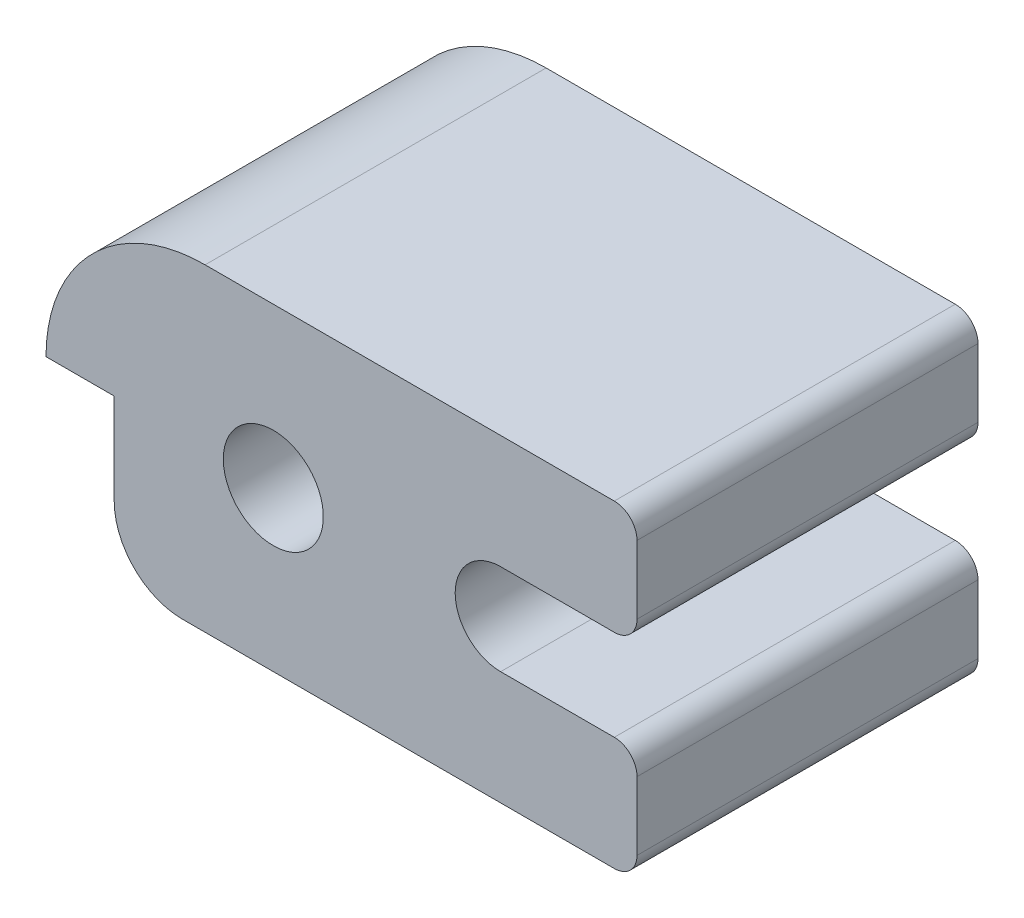
ISO-10303-21;
HEADER;
FILE_DESCRIPTION(('STEP AP214'),'2;1');
FILE_NAME('part.step','',(''),(''),'','','');
FILE_SCHEMA(('AUTOMOTIVE_DESIGN { 1 0 10303 214 1 1 1 1 }'));
ENDSEC;
DATA;
#1=APPLICATION_CONTEXT('core data for automotive mechanical design processes');
#2=APPLICATION_PROTOCOL_DEFINITION('international standard','automotive_design',2000,#1);
#3=PRODUCT_CONTEXT('',#1,'mechanical');
#4=PRODUCT('Part','Part','',(#3));
#5=PRODUCT_RELATED_PRODUCT_CATEGORY('part','',(#4));
#6=PRODUCT_DEFINITION_FORMATION('','',#4);
#7=PRODUCT_DEFINITION_CONTEXT('part definition',#1,'design');
#8=PRODUCT_DEFINITION('design','',#6,#7);
#9=PRODUCT_DEFINITION_SHAPE('','',#8);
#10=(LENGTH_UNIT() NAMED_UNIT(*) SI_UNIT(.MILLI.,.METRE.));
#11=(NAMED_UNIT(*) PLANE_ANGLE_UNIT() SI_UNIT($,.RADIAN.));
#12=(NAMED_UNIT(*) SI_UNIT($,.STERADIAN.) SOLID_ANGLE_UNIT());
#13=UNCERTAINTY_MEASURE_WITH_UNIT(LENGTH_MEASURE(1.E-05),#10,'distance_accuracy_value','');
#14=(GEOMETRIC_REPRESENTATION_CONTEXT(3) GLOBAL_UNCERTAINTY_ASSIGNED_CONTEXT((#13)) GLOBAL_UNIT_ASSIGNED_CONTEXT((#10,
#11,#12)) REPRESENTATION_CONTEXT('',''));
#15=CARTESIAN_POINT('',(0.,0.,0.));
#16=DIRECTION('',(0.,0.,1.));
#17=DIRECTION('',(1.,0.,0.));
#18=AXIS2_PLACEMENT_3D('',#15,#16,#17);
#19=CARTESIAN_POINT('',(12.7,0.,19.05));
#20=DIRECTION('',(0.,0.,-1.));
#21=DIRECTION('',(-1.,0.,0.));
#22=AXIS2_PLACEMENT_3D('',#19,#20,#21);
#23=PLANE('',#22);
#24=DIRECTION('',(0.,-1.,0.));
#25=VECTOR('',#24,1.);
#26=CARTESIAN_POINT('',(-8.89,0.,19.05));
#27=LINE('',#26,#25);
#28=CARTESIAN_POINT('',(-8.89,0.,19.05));
#29=VERTEX_POINT('',#28);
#30=CARTESIAN_POINT('',(-8.89,-5.08,19.05));
#31=VERTEX_POINT('',#30);
#32=EDGE_CURVE('E199',#29,#31,#27,.T.);
#33=ORIENTED_EDGE('',*,*,#32,.T.);
#34=CARTESIAN_POINT('',(-5.08,-5.08,19.05));
#35=DIRECTION('',(0.,0.,-1.));
#36=DIRECTION('',(-1.,0.,0.));
#37=AXIS2_PLACEMENT_3D('',#34,#35,#36);
#38=CIRCLE('',#37,3.81);
#39=CARTESIAN_POINT('',(-5.08,-8.89,19.05));
#40=VERTEX_POINT('',#39);
#41=EDGE_CURVE('E11',#31,#40,#38,.F.);
#42=ORIENTED_EDGE('',*,*,#41,.T.);
#43=DIRECTION('',(1.,0.,0.));
#44=VECTOR('',#43,1.);
#45=CARTESIAN_POINT('',(-8.89,-8.89,19.05));
#46=LINE('',#45,#44);
#47=CARTESIAN_POINT('',(19.05,-8.89,19.05));
#48=VERTEX_POINT('',#47);
#49=EDGE_CURVE('E202',#40,#48,#46,.T.);
#50=ORIENTED_EDGE('',*,*,#49,.T.);
#51=CARTESIAN_POINT('',(19.05,-7.62,19.05));
#52=DIRECTION('',(0.,0.,-1.));
#53=DIRECTION('',(-1.,0.,0.));
#54=AXIS2_PLACEMENT_3D('',#51,#52,#53);
#55=CIRCLE('',#54,1.27);
#56=CARTESIAN_POINT('',(20.32,-7.62,19.05));
#57=VERTEX_POINT('',#56);
#58=EDGE_CURVE('E287',#48,#57,#55,.F.);
#59=ORIENTED_EDGE('',*,*,#58,.T.);
#60=DIRECTION('',(0.,1.,0.));
#61=VECTOR('',#60,1.);
#62=CARTESIAN_POINT('',(20.32,-8.89,19.05));
#63=LINE('',#62,#61);
#64=CARTESIAN_POINT('',(20.32,-3.81,19.05));
#65=VERTEX_POINT('',#64);
#66=EDGE_CURVE('E166',#57,#65,#63,.T.);
#67=ORIENTED_EDGE('',*,*,#66,.T.);
#68=CARTESIAN_POINT('',(19.05,-3.81,19.05));
#69=DIRECTION('',(0.,0.,-1.));
#70=DIRECTION('',(-1.,0.,0.));
#71=AXIS2_PLACEMENT_3D('',#68,#69,#70);
#72=CIRCLE('',#71,1.27);
#73=CARTESIAN_POINT('',(19.05,-2.54,19.05));
#74=VERTEX_POINT('',#73);
#75=EDGE_CURVE('E161',#65,#74,#72,.F.);
#76=ORIENTED_EDGE('',*,*,#75,.T.);
#77=DIRECTION('',(-1.,0.,0.));
#78=VECTOR('',#77,1.);
#79=CARTESIAN_POINT('',(12.7,-2.54,19.05));
#80=LINE('',#79,#78);
#81=CARTESIAN_POINT('',(12.7,-2.54,19.05));
#82=VERTEX_POINT('',#81);
#83=EDGE_CURVE('E152',#74,#82,#80,.T.);
#84=ORIENTED_EDGE('',*,*,#83,.T.);
#85=CARTESIAN_POINT('',(12.7,0.,19.05));
#86=DIRECTION('',(0.,0.,-1.));
#87=DIRECTION('',(-1.,0.,0.));
#88=AXIS2_PLACEMENT_3D('',#85,#86,#87);
#89=CIRCLE('',#88,2.54);
#90=CARTESIAN_POINT('',(12.7,2.54,19.05));
#91=VERTEX_POINT('',#90);
#92=EDGE_CURVE('E157',#82,#91,#89,.T.);
#93=ORIENTED_EDGE('',*,*,#92,.T.);
#94=DIRECTION('',(1.,0.,0.));
#95=VECTOR('',#94,1.);
#96=CARTESIAN_POINT('',(12.7,2.54,19.05));
#97=LINE('',#96,#95);
#98=CARTESIAN_POINT('',(19.05,2.54,19.05));
#99=VERTEX_POINT('',#98);
#100=EDGE_CURVE('E183',#91,#99,#97,.T.);
#101=ORIENTED_EDGE('',*,*,#100,.T.);
#102=CARTESIAN_POINT('',(19.05,3.81,19.05));
#103=DIRECTION('',(0.,0.,-1.));
#104=DIRECTION('',(-1.,0.,0.));
#105=AXIS2_PLACEMENT_3D('',#102,#103,#104);
#106=CIRCLE('',#105,1.27);
#107=CARTESIAN_POINT('',(20.32,3.81,19.05));
#108=VERTEX_POINT('',#107);
#109=EDGE_CURVE('E282',#99,#108,#106,.F.);
#110=ORIENTED_EDGE('',*,*,#109,.T.);
#111=DIRECTION('',(0.,1.,0.));
#112=VECTOR('',#111,1.);
#113=CARTESIAN_POINT('',(20.32,2.54,19.05));
#114=LINE('',#113,#112);
#115=CARTESIAN_POINT('',(20.32,7.62,19.05));
#116=VERTEX_POINT('',#115);
#117=EDGE_CURVE('E186',#108,#116,#114,.T.);
#118=ORIENTED_EDGE('',*,*,#117,.T.);
#119=CARTESIAN_POINT('',(19.05,7.62,19.05));
#120=DIRECTION('',(0.,0.,-1.));
#121=DIRECTION('',(-1.,0.,0.));
#122=AXIS2_PLACEMENT_3D('',#119,#120,#121);
#123=CIRCLE('',#122,1.27);
#124=CARTESIAN_POINT('',(19.05,8.89,19.05));
#125=VERTEX_POINT('',#124);
#126=EDGE_CURVE('E279',#116,#125,#123,.F.);
#127=ORIENTED_EDGE('',*,*,#126,.T.);
#128=DIRECTION('',(-1.,0.,0.));
#129=VECTOR('',#128,1.);
#130=CARTESIAN_POINT('',(20.32,8.89,19.05));
#131=LINE('',#130,#129);
#132=CARTESIAN_POINT('',(-3.81,8.89,19.05));
#133=VERTEX_POINT('',#132);
#134=EDGE_CURVE('E193',#125,#133,#131,.T.);
#135=ORIENTED_EDGE('',*,*,#134,.T.);
#136=CARTESIAN_POINT('',(-3.81,0.,19.05));
#137=DIRECTION('',(0.,0.,-1.));
#138=DIRECTION('',(-1.,0.,0.));
#139=AXIS2_PLACEMENT_3D('',#136,#137,#138);
#140=CIRCLE('',#139,8.89);
#141=CARTESIAN_POINT('',(-12.7,0.,19.05));
#142=VERTEX_POINT('',#141);
#143=EDGE_CURVE('E252',#133,#142,#140,.F.);
#144=ORIENTED_EDGE('',*,*,#143,.T.);
#145=DIRECTION('',(1.,0.,0.));
#146=VECTOR('',#145,1.);
#147=CARTESIAN_POINT('',(-12.7,0.,19.05));
#148=LINE('',#147,#146);
#149=EDGE_CURVE('E196',#142,#29,#148,.T.);
#150=ORIENTED_EDGE('',*,*,#149,.T.);
#151=EDGE_LOOP('',(#33,#42,#50,#59,#67,#76,#84,#93,#101,#110,#118,#127,#135,#144,#150));
#152=FACE_BOUND('',#151,.T.);
#153=CARTESIAN_POINT('',(0.,0.,19.05));
#154=DIRECTION('',(0.,0.,1.));
#155=DIRECTION('',(1.,0.,0.));
#156=AXIS2_PLACEMENT_3D('',#153,#154,#155);
#157=CIRCLE('',#156,2.794);
#158=CARTESIAN_POINT('',(-2.794,0.,19.05));
#159=VERTEX_POINT('',#158);
#160=EDGE_CURVE('E210',#159,#159,#157,.T.);
#161=ORIENTED_EDGE('',*,*,#160,.F.);
#162=EDGE_LOOP('',(#161));
#163=FACE_BOUND('',#162,.T.);
#164=ADVANCED_FACE('F45',(#152,#163),#23,.F.);
#165=CARTESIAN_POINT('',(12.7,0.,0.));
#166=DIRECTION('',(0.,0.,-1.));
#167=DIRECTION('',(-1.,0.,0.));
#168=AXIS2_PLACEMENT_3D('',#165,#166,#167);
#169=PLANE('',#168);
#170=DIRECTION('',(1.,0.,0.));
#171=VECTOR('',#170,1.);
#172=CARTESIAN_POINT('',(-8.89,-8.89,0.));
#173=LINE('',#172,#171);
#174=CARTESIAN_POINT('',(-5.08,-8.89,0.));
#175=VERTEX_POINT('',#174);
#176=CARTESIAN_POINT('',(19.05,-8.89,0.));
#177=VERTEX_POINT('',#176);
#178=EDGE_CURVE('E233',#175,#177,#173,.T.);
#179=ORIENTED_EDGE('',*,*,#178,.F.);
#180=CARTESIAN_POINT('',(-5.08,-5.08,0.));
#181=DIRECTION('',(0.,0.,-1.));
#182=DIRECTION('',(-1.,0.,0.));
#183=AXIS2_PLACEMENT_3D('',#180,#181,#182);
#184=CIRCLE('',#183,3.81);
#185=CARTESIAN_POINT('',(-8.89,-5.08,0.));
#186=VERTEX_POINT('',#185);
#187=EDGE_CURVE('E68',#175,#186,#184,.T.);
#188=ORIENTED_EDGE('',*,*,#187,.T.);
#189=DIRECTION('',(0.,-1.,0.));
#190=VECTOR('',#189,1.);
#191=CARTESIAN_POINT('',(-8.89,0.,0.));
#192=LINE('',#191,#190);
#193=CARTESIAN_POINT('',(-8.89,0.,0.));
#194=VERTEX_POINT('',#193);
#195=EDGE_CURVE('E230',#194,#186,#192,.T.);
#196=ORIENTED_EDGE('',*,*,#195,.F.);
#197=DIRECTION('',(1.,0.,0.));
#198=VECTOR('',#197,1.);
#199=CARTESIAN_POINT('',(-12.7,0.,0.));
#200=LINE('',#199,#198);
#201=CARTESIAN_POINT('',(-12.7,0.,0.));
#202=VERTEX_POINT('',#201);
#203=EDGE_CURVE('E227',#202,#194,#200,.T.);
#204=ORIENTED_EDGE('',*,*,#203,.F.);
#205=CARTESIAN_POINT('',(-3.81,0.,0.));
#206=DIRECTION('',(0.,0.,-1.));
#207=DIRECTION('',(-1.,0.,0.));
#208=AXIS2_PLACEMENT_3D('',#205,#206,#207);
#209=CIRCLE('',#208,8.89);
#210=CARTESIAN_POINT('',(-3.81,8.89,0.));
#211=VERTEX_POINT('',#210);
#212=EDGE_CURVE('E176',#202,#211,#209,.T.);
#213=ORIENTED_EDGE('',*,*,#212,.T.);
#214=DIRECTION('',(-1.,0.,0.));
#215=VECTOR('',#214,1.);
#216=CARTESIAN_POINT('',(20.32,8.89,0.));
#217=LINE('',#216,#215);
#218=CARTESIAN_POINT('',(19.05,8.89,0.));
#219=VERTEX_POINT('',#218);
#220=EDGE_CURVE('E224',#219,#211,#217,.T.);
#221=ORIENTED_EDGE('',*,*,#220,.F.);
#222=CARTESIAN_POINT('',(19.05,7.62,0.));
#223=DIRECTION('',(0.,0.,-1.));
#224=DIRECTION('',(-1.,0.,0.));
#225=AXIS2_PLACEMENT_3D('',#222,#223,#224);
#226=CIRCLE('',#225,1.27);
#227=CARTESIAN_POINT('',(20.32,7.62,0.));
#228=VERTEX_POINT('',#227);
#229=EDGE_CURVE('E262',#219,#228,#226,.T.);
#230=ORIENTED_EDGE('',*,*,#229,.T.);
#231=DIRECTION('',(0.,1.,0.));
#232=VECTOR('',#231,1.);
#233=CARTESIAN_POINT('',(20.32,2.54,0.));
#234=LINE('',#233,#232);
#235=CARTESIAN_POINT('',(20.32,3.81,0.));
#236=VERTEX_POINT('',#235);
#237=EDGE_CURVE('E220',#236,#228,#234,.T.);
#238=ORIENTED_EDGE('',*,*,#237,.F.);
#239=CARTESIAN_POINT('',(19.05,3.81,0.));
#240=DIRECTION('',(0.,0.,-1.));
#241=DIRECTION('',(-1.,0.,0.));
#242=AXIS2_PLACEMENT_3D('',#239,#240,#241);
#243=CIRCLE('',#242,1.27);
#244=CARTESIAN_POINT('',(19.05,2.54,0.));
#245=VERTEX_POINT('',#244);
#246=EDGE_CURVE('E265',#236,#245,#243,.T.);
#247=ORIENTED_EDGE('',*,*,#246,.T.);
#248=DIRECTION('',(1.,0.,0.));
#249=VECTOR('',#248,1.);
#250=CARTESIAN_POINT('',(12.7,2.54,0.));
#251=LINE('',#250,#249);
#252=CARTESIAN_POINT('',(12.7,2.54,0.));
#253=VERTEX_POINT('',#252);
#254=EDGE_CURVE('E216',#253,#245,#251,.T.);
#255=ORIENTED_EDGE('',*,*,#254,.F.);
#256=CARTESIAN_POINT('',(12.7,0.,0.));
#257=DIRECTION('',(0.,0.,-1.));
#258=DIRECTION('',(-1.,0.,0.));
#259=AXIS2_PLACEMENT_3D('',#256,#257,#258);
#260=CIRCLE('',#259,2.54);
#261=CARTESIAN_POINT('',(12.7,-2.54,0.));
#262=VERTEX_POINT('',#261);
#263=EDGE_CURVE('E213',#262,#253,#260,.T.);
#264=ORIENTED_EDGE('',*,*,#263,.F.);
#265=DIRECTION('',(-1.,0.,0.));
#266=VECTOR('',#265,1.);
#267=CARTESIAN_POINT('',(12.7,-2.54,0.));
#268=LINE('',#267,#266);
#269=CARTESIAN_POINT('',(19.05,-2.54,0.));
#270=VERTEX_POINT('',#269);
#271=EDGE_CURVE('E172',#270,#262,#268,.T.);
#272=ORIENTED_EDGE('',*,*,#271,.F.);
#273=CARTESIAN_POINT('',(19.05,-3.81,0.));
#274=DIRECTION('',(0.,0.,-1.));
#275=DIRECTION('',(-1.,0.,0.));
#276=AXIS2_PLACEMENT_3D('',#273,#274,#275);
#277=CIRCLE('',#276,1.27);
#278=CARTESIAN_POINT('',(20.32,-3.81,0.));
#279=VERTEX_POINT('',#278);
#280=EDGE_CURVE('E268',#270,#279,#277,.T.);
#281=ORIENTED_EDGE('',*,*,#280,.T.);
#282=DIRECTION('',(0.,1.,0.));
#283=VECTOR('',#282,1.);
#284=CARTESIAN_POINT('',(20.32,-8.89,0.));
#285=LINE('',#284,#283);
#286=CARTESIAN_POINT('',(20.32,-7.62,0.));
#287=VERTEX_POINT('',#286);
#288=EDGE_CURVE('E206',#287,#279,#285,.T.);
#289=ORIENTED_EDGE('',*,*,#288,.F.);
#290=CARTESIAN_POINT('',(19.05,-7.62,0.));
#291=DIRECTION('',(0.,0.,-1.));
#292=DIRECTION('',(-1.,0.,0.));
#293=AXIS2_PLACEMENT_3D('',#290,#291,#292);
#294=CIRCLE('',#293,1.27);
#295=EDGE_CURVE('E271',#287,#177,#294,.T.);
#296=ORIENTED_EDGE('',*,*,#295,.T.);
#297=EDGE_LOOP('',(#179,#188,#196,#204,#213,#221,#230,#238,#247,#255,#264,#272,#281,#289,#296));
#298=FACE_BOUND('',#297,.T.);
#299=CARTESIAN_POINT('',(0.,0.,0.));
#300=DIRECTION('',(0.,0.,1.));
#301=DIRECTION('',(1.,0.,0.));
#302=AXIS2_PLACEMENT_3D('',#299,#300,#301);
#303=CIRCLE('',#302,2.794);
#304=CARTESIAN_POINT('',(-2.794,0.,0.));
#305=VERTEX_POINT('',#304);
#306=EDGE_CURVE('E333',#305,#305,#303,.T.);
#307=ORIENTED_EDGE('',*,*,#306,.T.);
#308=EDGE_LOOP('',(#307));
#309=FACE_BOUND('',#308,.T.);
#310=ADVANCED_FACE('F319',(#298,#309),#169,.T.);
#311=CARTESIAN_POINT('',(20.32,-8.89,19.05));
#312=DIRECTION('',(-1.,0.,0.));
#313=DIRECTION('',(0.,0.,1.));
#314=AXIS2_PLACEMENT_3D('',#311,#312,#313);
#315=PLANE('',#314);
#316=ORIENTED_EDGE('',*,*,#66,.F.);
#317=DIRECTION('',(0.,0.,-1.));
#318=VECTOR('',#317,1.);
#319=CARTESIAN_POINT('',(20.32,-7.62,19.05));
#320=LINE('',#319,#318);
#321=EDGE_CURVE('E258',#57,#287,#320,.T.);
#322=ORIENTED_EDGE('',*,*,#321,.T.);
#323=ORIENTED_EDGE('',*,*,#288,.T.);
#324=DIRECTION('',(0.,0.,-1.));
#325=VECTOR('',#324,1.);
#326=CARTESIAN_POINT('',(20.32,-3.81,19.05));
#327=LINE('',#326,#325);
#328=EDGE_CURVE('E255',#279,#65,#327,.F.);
#329=ORIENTED_EDGE('',*,*,#328,.T.);
#330=EDGE_LOOP('',(#316,#322,#323,#329));
#331=FACE_BOUND('',#330,.T.);
#332=ADVANCED_FACE('F329',(#331),#315,.F.);
#333=CARTESIAN_POINT('',(12.7,-2.54,19.05));
#334=DIRECTION('',(0.,-1.,0.));
#335=DIRECTION('',(1.,0.,0.));
#336=AXIS2_PLACEMENT_3D('',#333,#334,#335);
#337=PLANE('',#336);
#338=ORIENTED_EDGE('',*,*,#83,.F.);
#339=DIRECTION('',(0.,0.,-1.));
#340=VECTOR('',#339,1.);
#341=CARTESIAN_POINT('',(19.05,-2.54,19.05));
#342=LINE('',#341,#340);
#343=EDGE_CURVE('E290',#74,#270,#342,.T.);
#344=ORIENTED_EDGE('',*,*,#343,.T.);
#345=ORIENTED_EDGE('',*,*,#271,.T.);
#346=DIRECTION('',(0.,0.,-1.));
#347=VECTOR('',#346,1.);
#348=CARTESIAN_POINT('',(12.7,-2.54,19.05));
#349=LINE('',#348,#347);
#350=EDGE_CURVE('E169',#82,#262,#349,.T.);
#351=ORIENTED_EDGE('',*,*,#350,.F.);
#352=EDGE_LOOP('',(#338,#344,#345,#351));
#353=FACE_BOUND('',#352,.T.);
#354=ADVANCED_FACE('F170',(#353),#337,.F.);
#355=CARTESIAN_POINT('',(12.7,0.,19.05));
#356=DIRECTION('',(0.,0.,-1.));
#357=DIRECTION('',(-1.,0.,0.));
#358=AXIS2_PLACEMENT_3D('',#355,#356,#357);
#359=CYLINDRICAL_SURFACE('',#358,2.54);
#360=ORIENTED_EDGE('',*,*,#263,.T.);
#361=DIRECTION('',(0.,0.,-1.));
#362=VECTOR('',#361,1.);
#363=CARTESIAN_POINT('',(12.7,2.54,19.05));
#364=LINE('',#363,#362);
#365=EDGE_CURVE('E177',#91,#253,#364,.T.);
#366=ORIENTED_EDGE('',*,*,#365,.F.);
#367=ORIENTED_EDGE('',*,*,#92,.F.);
#368=ORIENTED_EDGE('',*,*,#350,.T.);
#369=EDGE_LOOP('',(#360,#366,#367,#368));
#370=FACE_BOUND('',#369,.T.);
#371=ADVANCED_FACE('F179',(#370),#359,.F.);
#372=CARTESIAN_POINT('',(12.7,2.54,19.05));
#373=DIRECTION('',(0.,1.,0.));
#374=DIRECTION('',(-1.,0.,0.));
#375=AXIS2_PLACEMENT_3D('',#372,#373,#374);
#376=PLANE('',#375);
#377=ORIENTED_EDGE('',*,*,#254,.T.);
#378=DIRECTION('',(0.,0.,-1.));
#379=VECTOR('',#378,1.);
#380=CARTESIAN_POINT('',(19.05,2.54,19.05));
#381=LINE('',#380,#379);
#382=EDGE_CURVE('E300',#245,#99,#381,.F.);
#383=ORIENTED_EDGE('',*,*,#382,.T.);
#384=ORIENTED_EDGE('',*,*,#100,.F.);
#385=ORIENTED_EDGE('',*,*,#365,.T.);
#386=EDGE_LOOP('',(#377,#383,#384,#385));
#387=FACE_BOUND('',#386,.T.);
#388=ADVANCED_FACE('F368',(#387),#376,.F.);
#389=CARTESIAN_POINT('',(20.32,2.54,19.05));
#390=DIRECTION('',(-1.,0.,0.));
#391=DIRECTION('',(0.,0.,1.));
#392=AXIS2_PLACEMENT_3D('',#389,#390,#391);
#393=PLANE('',#392);
#394=ORIENTED_EDGE('',*,*,#117,.F.);
#395=DIRECTION('',(0.,0.,-1.));
#396=VECTOR('',#395,1.);
#397=CARTESIAN_POINT('',(20.32,3.81,19.05));
#398=LINE('',#397,#396);
#399=EDGE_CURVE('E296',#108,#236,#398,.T.);
#400=ORIENTED_EDGE('',*,*,#399,.T.);
#401=ORIENTED_EDGE('',*,*,#237,.T.);
#402=DIRECTION('',(0.,0.,-1.));
#403=VECTOR('',#402,1.);
#404=CARTESIAN_POINT('',(20.32,7.62,19.05));
#405=LINE('',#404,#403);
#406=EDGE_CURVE('E293',#228,#116,#405,.F.);
#407=ORIENTED_EDGE('',*,*,#406,.T.);
#408=EDGE_LOOP('',(#394,#400,#401,#407));
#409=FACE_BOUND('',#408,.T.);
#410=ADVANCED_FACE('F364',(#409),#393,.F.);
#411=CARTESIAN_POINT('',(20.32,8.89,19.05));
#412=DIRECTION('',(0.,-1.,0.));
#413=DIRECTION('',(0.,0.,-1.));
#414=AXIS2_PLACEMENT_3D('',#411,#412,#413);
#415=PLANE('',#414);
#416=ORIENTED_EDGE('',*,*,#134,.F.);
#417=DIRECTION('',(0.,0.,-1.));
#418=VECTOR('',#417,1.);
#419=CARTESIAN_POINT('',(19.05,8.89,19.05));
#420=LINE('',#419,#418);
#421=EDGE_CURVE('E303',#125,#219,#420,.T.);
#422=ORIENTED_EDGE('',*,*,#421,.T.);
#423=ORIENTED_EDGE('',*,*,#220,.T.);
#424=DIRECTION('',(0.,0.,-1.));
#425=VECTOR('',#424,1.);
#426=CARTESIAN_POINT('',(-3.81,8.89,19.05));
#427=LINE('',#426,#425);
#428=EDGE_CURVE('E248',#211,#133,#427,.F.);
#429=ORIENTED_EDGE('',*,*,#428,.T.);
#430=EDGE_LOOP('',(#416,#422,#423,#429));
#431=FACE_BOUND('',#430,.T.);
#432=ADVANCED_FACE('F360',(#431),#415,.F.);
#433=CARTESIAN_POINT('',(-12.7,0.,19.05));
#434=DIRECTION('',(0.,1.,0.));
#435=DIRECTION('',(0.,0.,1.));
#436=AXIS2_PLACEMENT_3D('',#433,#434,#435);
#437=PLANE('',#436);
#438=ORIENTED_EDGE('',*,*,#203,.T.);
#439=DIRECTION('',(0.,0.,-1.));
#440=VECTOR('',#439,1.);
#441=CARTESIAN_POINT('',(-8.89,0.,19.05));
#442=LINE('',#441,#440);
#443=EDGE_CURVE('E205',#29,#194,#442,.T.);
#444=ORIENTED_EDGE('',*,*,#443,.F.);
#445=ORIENTED_EDGE('',*,*,#149,.F.);
#446=DIRECTION('',(0.,0.,-1.));
#447=VECTOR('',#446,1.);
#448=CARTESIAN_POINT('',(-12.7,0.,19.05));
#449=LINE('',#448,#447);
#450=EDGE_CURVE('E239',#142,#202,#449,.T.);
#451=ORIENTED_EDGE('',*,*,#450,.T.);
#452=EDGE_LOOP('',(#438,#444,#445,#451));
#453=FACE_BOUND('',#452,.T.);
#454=ADVANCED_FACE('F357',(#453),#437,.F.);
#455=CARTESIAN_POINT('',(-8.89,0.,19.05));
#456=DIRECTION('',(1.,0.,0.));
#457=DIRECTION('',(0.,1.,0.));
#458=AXIS2_PLACEMENT_3D('',#455,#456,#457);
#459=PLANE('',#458);
#460=ORIENTED_EDGE('',*,*,#195,.T.);
#461=DIRECTION('',(0.,0.,-1.));
#462=VECTOR('',#461,1.);
#463=CARTESIAN_POINT('',(-8.89,-5.08,19.05));
#464=LINE('',#463,#462);
#465=EDGE_CURVE('E54',#186,#31,#464,.F.);
#466=ORIENTED_EDGE('',*,*,#465,.T.);
#467=ORIENTED_EDGE('',*,*,#32,.F.);
#468=ORIENTED_EDGE('',*,*,#443,.T.);
#469=EDGE_LOOP('',(#460,#466,#467,#468));
#470=FACE_BOUND('',#469,.T.);
#471=ADVANCED_FACE('F354',(#470),#459,.F.);
#472=CARTESIAN_POINT('',(-8.89,-8.89,19.05));
#473=DIRECTION('',(0.,1.,0.));
#474=DIRECTION('',(0.,0.,1.));
#475=AXIS2_PLACEMENT_3D('',#472,#473,#474);
#476=PLANE('',#475);
#477=ORIENTED_EDGE('',*,*,#49,.F.);
#478=DIRECTION('',(0.,0.,-1.));
#479=VECTOR('',#478,1.);
#480=CARTESIAN_POINT('',(-5.08,-8.89,19.05));
#481=LINE('',#480,#479);
#482=EDGE_CURVE('E307',#40,#175,#481,.T.);
#483=ORIENTED_EDGE('',*,*,#482,.T.);
#484=ORIENTED_EDGE('',*,*,#178,.T.);
#485=DIRECTION('',(0.,0.,-1.));
#486=VECTOR('',#485,1.);
#487=CARTESIAN_POINT('',(19.05,-8.89,19.05));
#488=LINE('',#487,#486);
#489=EDGE_CURVE('E275',#177,#48,#488,.F.);
#490=ORIENTED_EDGE('',*,*,#489,.T.);
#491=EDGE_LOOP('',(#477,#483,#484,#490));
#492=FACE_BOUND('',#491,.T.);
#493=ADVANCED_FACE('F316',(#492),#476,.F.);
#494=CARTESIAN_POINT('',(0.,0.,19.05));
#495=DIRECTION('',(0.,0.,-1.));
#496=DIRECTION('',(-1.,0.,0.));
#497=AXIS2_PLACEMENT_3D('',#494,#495,#496);
#498=CYLINDRICAL_SURFACE('',#497,2.794);
#499=CARTESIAN_POINT('',(-2.794,0.,19.05));
#500=CARTESIAN_POINT('',(-2.794,0.,18.8515625));
#501=CARTESIAN_POINT('',(-2.794,0.,18.653125));
#502=CARTESIAN_POINT('',(-2.794,0.,18.25625));
#503=CARTESIAN_POINT('',(-2.794,0.,18.0578125));
#504=CARTESIAN_POINT('',(-2.794,0.,17.6609375));
#505=CARTESIAN_POINT('',(-2.794,0.,17.4625));
#506=CARTESIAN_POINT('',(-2.794,0.,17.065625));
#507=CARTESIAN_POINT('',(-2.794,0.,16.8671875));
#508=CARTESIAN_POINT('',(-2.794,0.,16.4703125));
#509=CARTESIAN_POINT('',(-2.794,0.,16.271875));
#510=CARTESIAN_POINT('',(-2.794,0.,15.875));
#511=CARTESIAN_POINT('',(-2.794,0.,15.6765625));
#512=CARTESIAN_POINT('',(-2.794,0.,15.2796875));
#513=CARTESIAN_POINT('',(-2.794,0.,15.08125));
#514=CARTESIAN_POINT('',(-2.794,0.,14.684375));
#515=CARTESIAN_POINT('',(-2.794,0.,14.4859375));
#516=CARTESIAN_POINT('',(-2.794,0.,14.0890625));
#517=CARTESIAN_POINT('',(-2.794,0.,13.890625));
#518=CARTESIAN_POINT('',(-2.794,0.,13.49375));
#519=CARTESIAN_POINT('',(-2.794,0.,13.2953125));
#520=CARTESIAN_POINT('',(-2.794,0.,12.8984375));
#521=CARTESIAN_POINT('',(-2.794,0.,12.7));
#522=CARTESIAN_POINT('',(-2.794,0.,12.303125));
#523=CARTESIAN_POINT('',(-2.794,0.,12.1046875));
#524=CARTESIAN_POINT('',(-2.794,0.,11.7078125));
#525=CARTESIAN_POINT('',(-2.794,0.,11.509375));
#526=CARTESIAN_POINT('',(-2.794,0.,11.1125));
#527=CARTESIAN_POINT('',(-2.794,0.,10.9140625));
#528=CARTESIAN_POINT('',(-2.794,0.,10.5171875));
#529=CARTESIAN_POINT('',(-2.794,0.,10.31875));
#530=CARTESIAN_POINT('',(-2.794,0.,9.921875));
#531=CARTESIAN_POINT('',(-2.794,0.,9.7234375));
#532=CARTESIAN_POINT('',(-2.794,0.,9.3265625));
#533=CARTESIAN_POINT('',(-2.794,0.,9.128125));
#534=CARTESIAN_POINT('',(-2.794,0.,8.73125));
#535=CARTESIAN_POINT('',(-2.794,0.,8.5328125));
#536=CARTESIAN_POINT('',(-2.794,0.,8.1359375));
#537=CARTESIAN_POINT('',(-2.794,0.,7.9375));
#538=CARTESIAN_POINT('',(-2.794,0.,7.540625));
#539=CARTESIAN_POINT('',(-2.794,0.,7.3421875));
#540=CARTESIAN_POINT('',(-2.794,0.,6.9453125));
#541=CARTESIAN_POINT('',(-2.794,0.,6.746875));
#542=CARTESIAN_POINT('',(-2.794,0.,6.35));
#543=CARTESIAN_POINT('',(-2.794,0.,6.1515625));
#544=CARTESIAN_POINT('',(-2.794,0.,5.7546875));
#545=CARTESIAN_POINT('',(-2.794,0.,5.55625));
#546=CARTESIAN_POINT('',(-2.794,0.,5.159375));
#547=CARTESIAN_POINT('',(-2.794,0.,4.9609375));
#548=CARTESIAN_POINT('',(-2.794,0.,4.5640625));
#549=CARTESIAN_POINT('',(-2.794,0.,4.365625));
#550=CARTESIAN_POINT('',(-2.794,0.,3.96875));
#551=CARTESIAN_POINT('',(-2.794,0.,3.7703125));
#552=CARTESIAN_POINT('',(-2.794,0.,3.3734375));
#553=CARTESIAN_POINT('',(-2.794,0.,3.175));
#554=CARTESIAN_POINT('',(-2.794,0.,2.778125));
#555=CARTESIAN_POINT('',(-2.794,0.,2.5796875));
#556=CARTESIAN_POINT('',(-2.794,0.,2.1828125));
#557=CARTESIAN_POINT('',(-2.794,0.,1.984375));
#558=CARTESIAN_POINT('',(-2.794,0.,1.5875));
#559=CARTESIAN_POINT('',(-2.794,0.,1.3890625));
#560=CARTESIAN_POINT('',(-2.794,0.,0.992187500000001));
#561=CARTESIAN_POINT('',(-2.794,0.,0.793750000000001));
#562=CARTESIAN_POINT('',(-2.794,0.,0.396875));
#563=CARTESIAN_POINT('',(-2.794,0.,0.1984375));
#564=CARTESIAN_POINT('',(-2.794,0.,0.));
#565=B_SPLINE_CURVE_WITH_KNOTS('',3,(#499,#500,#501,#502,#503,#504,#505,#506,#507,#508,#509,
#510,#511,#512,#513,#514,#515,#516,#517,#518,#519,#520,#521,#522,#523,#524,#525,#526,#527,#528,
#529,#530,#531,#532,#533,#534,#535,#536,#537,#538,#539,#540,#541,#542,#543,#544,#545,#546,#547,
#548,#549,#550,#551,#552,#553,#554,#555,#556,#557,#558,#559,#560,#561,#562,#563,#564),
.UNSPECIFIED.,.F.,.F.,(4,2,2,2,2,2,2,2,2,2,2,2,2,2,2,2,2,2,2,2,2,2,2,2,2,2,2,2,2,2,2,2,4),(0.,
0.5953125,1.190625,1.7859375,2.38125,2.9765625,3.571875,4.1671875,4.7625,5.3578125,5.953125,
6.5484375,7.14375,7.7390625,8.334375,8.9296875,9.525,10.1203125,10.715625,11.3109375,11.90625,
12.5015625,13.096875,13.6921875,14.2875,14.8828125,15.478125,16.0734375,16.66875,17.2640625,
17.859375,18.4546875,19.05),.UNSPECIFIED.);
#566=EDGE_CURVE('BSEAM341',#159,#305,#565,.T.);
#567=ORIENTED_EDGE('',*,*,#160,.T.);
#568=ORIENTED_EDGE('',*,*,#306,.F.);
#569=ORIENTED_EDGE('',*,*,#566,.T.);
#570=ORIENTED_EDGE('',*,*,#566,.F.);
#571=EDGE_LOOP('',(#567,#569,#568,#570));
#572=FACE_BOUND('',#571,.T.);
#573=ADVANCED_FACE('F341',(#572),#498,.F.);
#574=CARTESIAN_POINT('',(-3.81,0.,19.05));
#575=DIRECTION('',(0.,0.,-1.));
#576=DIRECTION('',(-1.,0.,0.));
#577=AXIS2_PLACEMENT_3D('',#574,#575,#576);
#578=CYLINDRICAL_SURFACE('',#577,8.89);
#579=ORIENTED_EDGE('',*,*,#143,.F.);
#580=ORIENTED_EDGE('',*,*,#428,.F.);
#581=ORIENTED_EDGE('',*,*,#212,.F.);
#582=ORIENTED_EDGE('',*,*,#450,.F.);
#583=EDGE_LOOP('',(#579,#580,#581,#582));
#584=FACE_BOUND('',#583,.T.);
#585=ADVANCED_FACE('F379',(#584),#578,.T.);
#586=CARTESIAN_POINT('',(19.05,-7.62,19.05));
#587=DIRECTION('',(0.,0.,-1.));
#588=DIRECTION('',(-1.,0.,0.));
#589=AXIS2_PLACEMENT_3D('',#586,#587,#588);
#590=CYLINDRICAL_SURFACE('',#589,1.27);
#591=ORIENTED_EDGE('',*,*,#58,.F.);
#592=ORIENTED_EDGE('',*,*,#489,.F.);
#593=ORIENTED_EDGE('',*,*,#295,.F.);
#594=ORIENTED_EDGE('',*,*,#321,.F.);
#595=EDGE_LOOP('',(#591,#592,#593,#594));
#596=FACE_BOUND('',#595,.T.);
#597=ADVANCED_FACE('F326',(#596),#590,.T.);
#598=CARTESIAN_POINT('',(19.05,-3.81,19.05));
#599=DIRECTION('',(0.,0.,-1.));
#600=DIRECTION('',(-1.,0.,0.));
#601=AXIS2_PLACEMENT_3D('',#598,#599,#600);
#602=CYLINDRICAL_SURFACE('',#601,1.27);
#603=ORIENTED_EDGE('',*,*,#75,.F.);
#604=ORIENTED_EDGE('',*,*,#328,.F.);
#605=ORIENTED_EDGE('',*,*,#280,.F.);
#606=ORIENTED_EDGE('',*,*,#343,.F.);
#607=EDGE_LOOP('',(#603,#604,#605,#606));
#608=FACE_BOUND('',#607,.T.);
#609=ADVANCED_FACE('F385',(#608),#602,.T.);
#610=CARTESIAN_POINT('',(19.05,3.81,19.05));
#611=DIRECTION('',(0.,0.,-1.));
#612=DIRECTION('',(-1.,0.,0.));
#613=AXIS2_PLACEMENT_3D('',#610,#611,#612);
#614=CYLINDRICAL_SURFACE('',#613,1.27);
#615=ORIENTED_EDGE('',*,*,#109,.F.);
#616=ORIENTED_EDGE('',*,*,#382,.F.);
#617=ORIENTED_EDGE('',*,*,#246,.F.);
#618=ORIENTED_EDGE('',*,*,#399,.F.);
#619=EDGE_LOOP('',(#615,#616,#617,#618));
#620=FACE_BOUND('',#619,.T.);
#621=ADVANCED_FACE('F388',(#620),#614,.T.);
#622=CARTESIAN_POINT('',(19.05,7.62,19.05));
#623=DIRECTION('',(0.,0.,-1.));
#624=DIRECTION('',(-1.,0.,0.));
#625=AXIS2_PLACEMENT_3D('',#622,#623,#624);
#626=CYLINDRICAL_SURFACE('',#625,1.27);
#627=ORIENTED_EDGE('',*,*,#126,.F.);
#628=ORIENTED_EDGE('',*,*,#406,.F.);
#629=ORIENTED_EDGE('',*,*,#229,.F.);
#630=ORIENTED_EDGE('',*,*,#421,.F.);
#631=EDGE_LOOP('',(#627,#628,#629,#630));
#632=FACE_BOUND('',#631,.T.);
#633=ADVANCED_FACE('F391',(#632),#626,.T.);
#634=CARTESIAN_POINT('',(-5.08,-5.08,19.05));
#635=DIRECTION('',(0.,0.,-1.));
#636=DIRECTION('',(-1.,0.,0.));
#637=AXIS2_PLACEMENT_3D('',#634,#635,#636);
#638=CYLINDRICAL_SURFACE('',#637,3.81);
#639=ORIENTED_EDGE('',*,*,#41,.F.);
#640=ORIENTED_EDGE('',*,*,#465,.F.);
#641=ORIENTED_EDGE('',*,*,#187,.F.);
#642=ORIENTED_EDGE('',*,*,#482,.F.);
#643=EDGE_LOOP('',(#639,#640,#641,#642));
#644=FACE_BOUND('',#643,.T.);
#645=ADVANCED_FACE('F47',(#644),#638,.T.);
#646=CLOSED_SHELL('',(#164,#310,#332,#354,#371,#388,#410,#432,#454,#471,#493,#573,#585,#597,
#609,#621,#633,#645));
#647=MANIFOLD_SOLID_BREP('B2',#646);
#648=ADVANCED_BREP_SHAPE_REPRESENTATION('',(#18,#647),#14);
#649=SHAPE_DEFINITION_REPRESENTATION(#9,#648);
ENDSEC;
END-ISO-10303-21;
